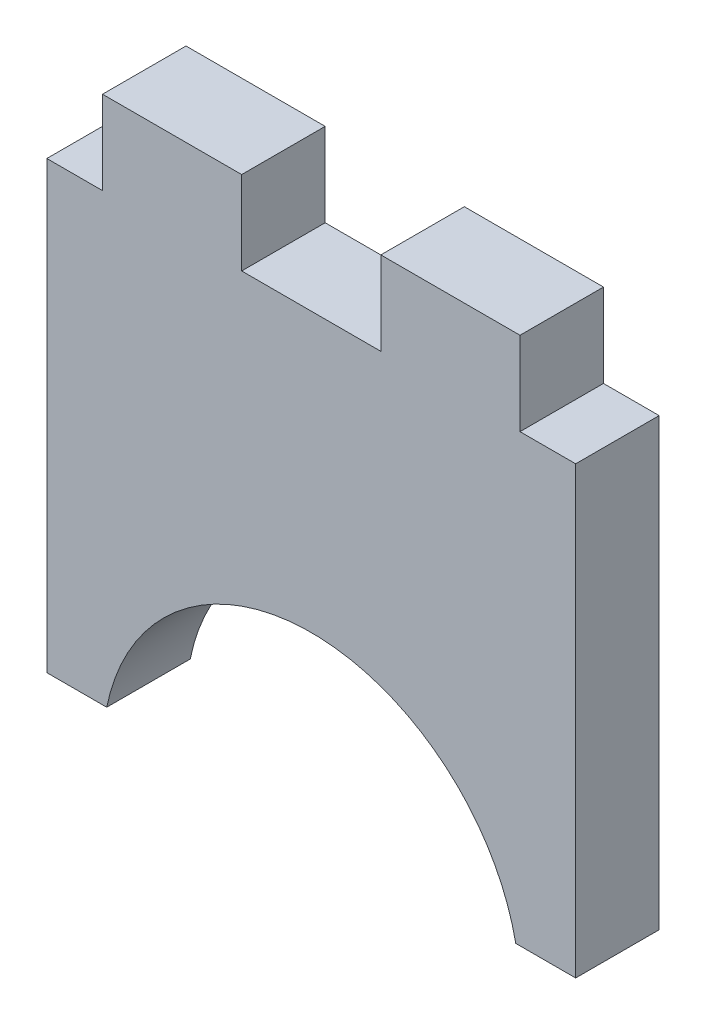
ISO-10303-21;
HEADER;
FILE_DESCRIPTION(('STEP AP214'),'2;1');
FILE_NAME('part.step','',(''),(''),'','','');
FILE_SCHEMA(('AUTOMOTIVE_DESIGN { 1 0 10303 214 1 1 1 1 }'));
ENDSEC;
DATA;
#1=APPLICATION_CONTEXT('core data for automotive mechanical design processes');
#2=APPLICATION_PROTOCOL_DEFINITION('international standard','automotive_design',2000,#1);
#3=PRODUCT_CONTEXT('',#1,'mechanical');
#4=PRODUCT('Part','Part','',(#3));
#5=PRODUCT_RELATED_PRODUCT_CATEGORY('part','',(#4));
#6=PRODUCT_DEFINITION_FORMATION('','',#4);
#7=PRODUCT_DEFINITION_CONTEXT('part definition',#1,'design');
#8=PRODUCT_DEFINITION('design','',#6,#7);
#9=PRODUCT_DEFINITION_SHAPE('','',#8);
#10=(LENGTH_UNIT() NAMED_UNIT(*) SI_UNIT(.MILLI.,.METRE.));
#11=(NAMED_UNIT(*) PLANE_ANGLE_UNIT() SI_UNIT($,.RADIAN.));
#12=(NAMED_UNIT(*) SI_UNIT($,.STERADIAN.) SOLID_ANGLE_UNIT());
#13=UNCERTAINTY_MEASURE_WITH_UNIT(LENGTH_MEASURE(1.E-05),#10,'distance_accuracy_value','');
#14=(GEOMETRIC_REPRESENTATION_CONTEXT(3) GLOBAL_UNCERTAINTY_ASSIGNED_CONTEXT((#13)) GLOBAL_UNIT_ASSIGNED_CONTEXT((#10,
#11,#12)) REPRESENTATION_CONTEXT('',''));
#15=CARTESIAN_POINT('',(0.,0.,0.));
#16=DIRECTION('',(0.,0.,1.));
#17=DIRECTION('',(1.,0.,0.));
#18=AXIS2_PLACEMENT_3D('',#15,#16,#17);
#19=CARTESIAN_POINT('',(-19.,0.,6.));
#20=DIRECTION('',(0.,0.,-1.));
#21=DIRECTION('',(-1.,0.,0.));
#22=AXIS2_PLACEMENT_3D('',#19,#20,#21);
#23=CYLINDRICAL_SURFACE('',#22,15.);
#24=CARTESIAN_POINT('',(-19.,0.,0.));
#25=DIRECTION('',(0.,0.,1.));
#26=DIRECTION('',(1.,0.,0.));
#27=AXIS2_PLACEMENT_3D('',#24,#25,#26);
#28=CIRCLE('',#27,15.);
#29=CARTESIAN_POINT('',(-4.30306154330094,3.,0.));
#30=VERTEX_POINT('',#29);
#31=CARTESIAN_POINT('',(-33.6969384566991,3.,0.));
#32=VERTEX_POINT('',#31);
#33=EDGE_CURVE('E164',#30,#32,#28,.T.);
#34=ORIENTED_EDGE('',*,*,#33,.F.);
#35=DIRECTION('',(0.,0.,-1.));
#36=VECTOR('',#35,1.);
#37=CARTESIAN_POINT('',(-4.30306154330094,3.,6.));
#38=LINE('',#37,#36);
#39=CARTESIAN_POINT('',(-4.30306154330094,3.,6.));
#40=VERTEX_POINT('',#39);
#41=EDGE_CURVE('E11',#40,#30,#38,.T.);
#42=ORIENTED_EDGE('',*,*,#41,.F.);
#43=CARTESIAN_POINT('',(-19.,0.,6.));
#44=DIRECTION('',(0.,0.,1.));
#45=DIRECTION('',(1.,0.,0.));
#46=AXIS2_PLACEMENT_3D('',#43,#44,#45);
#47=CIRCLE('',#46,15.);
#48=CARTESIAN_POINT('',(-33.6969384566991,3.,6.));
#49=VERTEX_POINT('',#48);
#50=EDGE_CURVE('E243',#40,#49,#47,.T.);
#51=ORIENTED_EDGE('',*,*,#50,.T.);
#52=DIRECTION('',(0.,0.,-1.));
#53=VECTOR('',#52,1.);
#54=CARTESIAN_POINT('',(-33.6969384566991,3.,6.));
#55=LINE('',#54,#53);
#56=EDGE_CURVE('E50',#49,#32,#55,.T.);
#57=ORIENTED_EDGE('',*,*,#56,.T.);
#58=EDGE_LOOP('',(#34,#42,#51,#57));
#59=FACE_BOUND('',#58,.T.);
#60=ADVANCED_FACE('F34',(#59),#23,.F.);
#61=CARTESIAN_POINT('',(0.,3.,6.));
#62=DIRECTION('',(0.,-1.,0.));
#63=DIRECTION('',(0.,0.,-1.));
#64=AXIS2_PLACEMENT_3D('',#61,#62,#63);
#65=PLANE('',#64);
#66=DIRECTION('',(-1.,0.,0.));
#67=VECTOR('',#66,1.);
#68=CARTESIAN_POINT('',(0.,3.,0.));
#69=LINE('',#68,#67);
#70=CARTESIAN_POINT('',(0.,3.,0.));
#71=VERTEX_POINT('',#70);
#72=EDGE_CURVE('E166',#71,#30,#69,.T.);
#73=ORIENTED_EDGE('',*,*,#72,.F.);
#74=DIRECTION('',(0.,0.,-1.));
#75=VECTOR('',#74,1.);
#76=CARTESIAN_POINT('',(0.,3.,6.));
#77=LINE('',#76,#75);
#78=CARTESIAN_POINT('',(0.,3.,6.));
#79=VERTEX_POINT('',#78);
#80=EDGE_CURVE('E42',#79,#71,#77,.T.);
#81=ORIENTED_EDGE('',*,*,#80,.F.);
#82=DIRECTION('',(-1.,0.,0.));
#83=VECTOR('',#82,1.);
#84=CARTESIAN_POINT('',(0.,3.,6.));
#85=LINE('',#84,#83);
#86=EDGE_CURVE('E161',#79,#40,#85,.T.);
#87=ORIENTED_EDGE('',*,*,#86,.T.);
#88=ORIENTED_EDGE('',*,*,#41,.T.);
#89=EDGE_LOOP('',(#73,#81,#87,#88));
#90=FACE_BOUND('',#89,.T.);
#91=ADVANCED_FACE('F228',(#90),#65,.T.);
#92=CARTESIAN_POINT('',(0.,0.,6.));
#93=DIRECTION('',(1.,0.,0.));
#94=DIRECTION('',(0.,0.,-1.));
#95=AXIS2_PLACEMENT_3D('',#92,#93,#94);
#96=PLANE('',#95);
#97=DIRECTION('',(0.,-1.,0.));
#98=VECTOR('',#97,1.);
#99=CARTESIAN_POINT('',(0.,0.,0.));
#100=LINE('',#99,#98);
#101=CARTESIAN_POINT('',(0.,35.,0.));
#102=VERTEX_POINT('',#101);
#103=EDGE_CURVE('E169',#102,#71,#100,.T.);
#104=ORIENTED_EDGE('',*,*,#103,.F.);
#105=DIRECTION('',(0.,0.,-1.));
#106=VECTOR('',#105,1.);
#107=CARTESIAN_POINT('',(0.,35.,6.));
#108=LINE('',#107,#106);
#109=CARTESIAN_POINT('',(0.,35.,6.));
#110=VERTEX_POINT('',#109);
#111=EDGE_CURVE('E217',#110,#102,#108,.T.);
#112=ORIENTED_EDGE('',*,*,#111,.F.);
#113=DIRECTION('',(0.,-1.,0.));
#114=VECTOR('',#113,1.);
#115=CARTESIAN_POINT('',(0.,0.,6.));
#116=LINE('',#115,#114);
#117=EDGE_CURVE('E224',#110,#79,#116,.T.);
#118=ORIENTED_EDGE('',*,*,#117,.T.);
#119=ORIENTED_EDGE('',*,*,#80,.T.);
#120=EDGE_LOOP('',(#104,#112,#118,#119));
#121=FACE_BOUND('',#120,.T.);
#122=ADVANCED_FACE('F222',(#121),#96,.T.);
#123=CARTESIAN_POINT('',(0.,35.,6.));
#124=DIRECTION('',(0.,1.,0.));
#125=DIRECTION('',(-1.,0.,0.));
#126=AXIS2_PLACEMENT_3D('',#123,#124,#125);
#127=PLANE('',#126);
#128=DIRECTION('',(1.,0.,0.));
#129=VECTOR('',#128,1.);
#130=CARTESIAN_POINT('',(0.,35.,0.));
#131=LINE('',#130,#129);
#132=CARTESIAN_POINT('',(-4.,35.,0.));
#133=VERTEX_POINT('',#132);
#134=EDGE_CURVE('E173',#133,#102,#131,.T.);
#135=ORIENTED_EDGE('',*,*,#134,.F.);
#136=DIRECTION('',(0.,0.,-1.));
#137=VECTOR('',#136,1.);
#138=CARTESIAN_POINT('',(-4.,35.,6.));
#139=LINE('',#138,#137);
#140=CARTESIAN_POINT('',(-4.,35.,6.));
#141=VERTEX_POINT('',#140);
#142=EDGE_CURVE('E215',#141,#133,#139,.T.);
#143=ORIENTED_EDGE('',*,*,#142,.F.);
#144=DIRECTION('',(1.,0.,0.));
#145=VECTOR('',#144,1.);
#146=CARTESIAN_POINT('',(0.,35.,6.));
#147=LINE('',#146,#145);
#148=EDGE_CURVE('E237',#141,#110,#147,.T.);
#149=ORIENTED_EDGE('',*,*,#148,.T.);
#150=ORIENTED_EDGE('',*,*,#111,.T.);
#151=EDGE_LOOP('',(#135,#143,#149,#150));
#152=FACE_BOUND('',#151,.T.);
#153=ADVANCED_FACE('F234',(#152),#127,.T.);
#154=CARTESIAN_POINT('',(-4.,0.,6.));
#155=DIRECTION('',(1.,0.,0.));
#156=DIRECTION('',(0.,0.,-1.));
#157=AXIS2_PLACEMENT_3D('',#154,#155,#156);
#158=PLANE('',#157);
#159=DIRECTION('',(0.,-1.,0.));
#160=VECTOR('',#159,1.);
#161=CARTESIAN_POINT('',(-4.,0.,0.));
#162=LINE('',#161,#160);
#163=CARTESIAN_POINT('',(-4.,41.,0.));
#164=VERTEX_POINT('',#163);
#165=EDGE_CURVE('E176',#164,#133,#162,.T.);
#166=ORIENTED_EDGE('',*,*,#165,.F.);
#167=DIRECTION('',(0.,0.,-1.));
#168=VECTOR('',#167,1.);
#169=CARTESIAN_POINT('',(-4.,41.,6.));
#170=LINE('',#169,#168);
#171=CARTESIAN_POINT('',(-4.,41.,6.));
#172=VERTEX_POINT('',#171);
#173=EDGE_CURVE('E213',#172,#164,#170,.T.);
#174=ORIENTED_EDGE('',*,*,#173,.F.);
#175=DIRECTION('',(0.,-1.,0.));
#176=VECTOR('',#175,1.);
#177=CARTESIAN_POINT('',(-4.,0.,6.));
#178=LINE('',#177,#176);
#179=EDGE_CURVE('E241',#172,#141,#178,.T.);
#180=ORIENTED_EDGE('',*,*,#179,.T.);
#181=ORIENTED_EDGE('',*,*,#142,.T.);
#182=EDGE_LOOP('',(#166,#174,#180,#181));
#183=FACE_BOUND('',#182,.T.);
#184=ADVANCED_FACE('F295',(#183),#158,.T.);
#185=CARTESIAN_POINT('',(0.,41.,6.));
#186=DIRECTION('',(0.,1.,0.));
#187=DIRECTION('',(-1.,0.,0.));
#188=AXIS2_PLACEMENT_3D('',#185,#186,#187);
#189=PLANE('',#188);
#190=DIRECTION('',(1.,0.,0.));
#191=VECTOR('',#190,1.);
#192=CARTESIAN_POINT('',(0.,41.,0.));
#193=LINE('',#192,#191);
#194=CARTESIAN_POINT('',(-14.,41.,0.));
#195=VERTEX_POINT('',#194);
#196=EDGE_CURVE('E179',#195,#164,#193,.T.);
#197=ORIENTED_EDGE('',*,*,#196,.F.);
#198=DIRECTION('',(0.,0.,-1.));
#199=VECTOR('',#198,1.);
#200=CARTESIAN_POINT('',(-14.,41.,6.));
#201=LINE('',#200,#199);
#202=CARTESIAN_POINT('',(-14.,41.,6.));
#203=VERTEX_POINT('',#202);
#204=EDGE_CURVE('E211',#203,#195,#201,.T.);
#205=ORIENTED_EDGE('',*,*,#204,.F.);
#206=DIRECTION('',(1.,0.,0.));
#207=VECTOR('',#206,1.);
#208=CARTESIAN_POINT('',(0.,41.,6.));
#209=LINE('',#208,#207);
#210=EDGE_CURVE('E247',#203,#172,#209,.T.);
#211=ORIENTED_EDGE('',*,*,#210,.T.);
#212=ORIENTED_EDGE('',*,*,#173,.T.);
#213=EDGE_LOOP('',(#197,#205,#211,#212));
#214=FACE_BOUND('',#213,.T.);
#215=ADVANCED_FACE('F302',(#214),#189,.T.);
#216=CARTESIAN_POINT('',(-14.,0.,6.));
#217=DIRECTION('',(-1.,0.,0.));
#218=DIRECTION('',(0.,0.,1.));
#219=AXIS2_PLACEMENT_3D('',#216,#217,#218);
#220=PLANE('',#219);
#221=DIRECTION('',(0.,1.,0.));
#222=VECTOR('',#221,1.);
#223=CARTESIAN_POINT('',(-14.,0.,0.));
#224=LINE('',#223,#222);
#225=CARTESIAN_POINT('',(-14.,35.,0.));
#226=VERTEX_POINT('',#225);
#227=EDGE_CURVE('E182',#226,#195,#224,.T.);
#228=ORIENTED_EDGE('',*,*,#227,.F.);
#229=DIRECTION('',(0.,0.,-1.));
#230=VECTOR('',#229,1.);
#231=CARTESIAN_POINT('',(-14.,35.,6.));
#232=LINE('',#231,#230);
#233=CARTESIAN_POINT('',(-14.,35.,6.));
#234=VERTEX_POINT('',#233);
#235=EDGE_CURVE('E209',#234,#226,#232,.T.);
#236=ORIENTED_EDGE('',*,*,#235,.F.);
#237=DIRECTION('',(0.,1.,0.));
#238=VECTOR('',#237,1.);
#239=CARTESIAN_POINT('',(-14.,0.,6.));
#240=LINE('',#239,#238);
#241=EDGE_CURVE('E250',#234,#203,#240,.T.);
#242=ORIENTED_EDGE('',*,*,#241,.T.);
#243=ORIENTED_EDGE('',*,*,#204,.T.);
#244=EDGE_LOOP('',(#228,#236,#242,#243));
#245=FACE_BOUND('',#244,.T.);
#246=ADVANCED_FACE('F310',(#245),#220,.T.);
#247=CARTESIAN_POINT('',(0.,35.,6.));
#248=DIRECTION('',(0.,1.,0.));
#249=DIRECTION('',(-1.,0.,0.));
#250=AXIS2_PLACEMENT_3D('',#247,#248,#249);
#251=PLANE('',#250);
#252=DIRECTION('',(1.,0.,0.));
#253=VECTOR('',#252,1.);
#254=CARTESIAN_POINT('',(0.,35.,0.));
#255=LINE('',#254,#253);
#256=CARTESIAN_POINT('',(-24.,35.,0.));
#257=VERTEX_POINT('',#256);
#258=EDGE_CURVE('E185',#257,#226,#255,.T.);
#259=ORIENTED_EDGE('',*,*,#258,.F.);
#260=DIRECTION('',(0.,0.,-1.));
#261=VECTOR('',#260,1.);
#262=CARTESIAN_POINT('',(-24.,35.,6.));
#263=LINE('',#262,#261);
#264=CARTESIAN_POINT('',(-24.,35.,6.));
#265=VERTEX_POINT('',#264);
#266=EDGE_CURVE('E207',#265,#257,#263,.T.);
#267=ORIENTED_EDGE('',*,*,#266,.F.);
#268=DIRECTION('',(1.,0.,0.));
#269=VECTOR('',#268,1.);
#270=CARTESIAN_POINT('',(0.,35.,6.));
#271=LINE('',#270,#269);
#272=EDGE_CURVE('E253',#265,#234,#271,.T.);
#273=ORIENTED_EDGE('',*,*,#272,.T.);
#274=ORIENTED_EDGE('',*,*,#235,.T.);
#275=EDGE_LOOP('',(#259,#267,#273,#274));
#276=FACE_BOUND('',#275,.T.);
#277=ADVANCED_FACE('F318',(#276),#251,.T.);
#278=CARTESIAN_POINT('',(-24.,0.,6.));
#279=DIRECTION('',(1.,0.,0.));
#280=DIRECTION('',(0.,0.,-1.));
#281=AXIS2_PLACEMENT_3D('',#278,#279,#280);
#282=PLANE('',#281);
#283=DIRECTION('',(0.,-1.,0.));
#284=VECTOR('',#283,1.);
#285=CARTESIAN_POINT('',(-24.,0.,0.));
#286=LINE('',#285,#284);
#287=CARTESIAN_POINT('',(-24.,41.,0.));
#288=VERTEX_POINT('',#287);
#289=EDGE_CURVE('E188',#288,#257,#286,.T.);
#290=ORIENTED_EDGE('',*,*,#289,.F.);
#291=DIRECTION('',(0.,0.,-1.));
#292=VECTOR('',#291,1.);
#293=CARTESIAN_POINT('',(-24.,41.,6.));
#294=LINE('',#293,#292);
#295=CARTESIAN_POINT('',(-24.,41.,6.));
#296=VERTEX_POINT('',#295);
#297=EDGE_CURVE('E205',#296,#288,#294,.T.);
#298=ORIENTED_EDGE('',*,*,#297,.F.);
#299=DIRECTION('',(0.,-1.,0.));
#300=VECTOR('',#299,1.);
#301=CARTESIAN_POINT('',(-24.,0.,6.));
#302=LINE('',#301,#300);
#303=EDGE_CURVE('E256',#296,#265,#302,.T.);
#304=ORIENTED_EDGE('',*,*,#303,.T.);
#305=ORIENTED_EDGE('',*,*,#266,.T.);
#306=EDGE_LOOP('',(#290,#298,#304,#305));
#307=FACE_BOUND('',#306,.T.);
#308=ADVANCED_FACE('F326',(#307),#282,.T.);
#309=CARTESIAN_POINT('',(0.,41.,6.));
#310=DIRECTION('',(0.,1.,0.));
#311=DIRECTION('',(0.,0.,1.));
#312=AXIS2_PLACEMENT_3D('',#309,#310,#311);
#313=PLANE('',#312);
#314=DIRECTION('',(1.,0.,0.));
#315=VECTOR('',#314,1.);
#316=CARTESIAN_POINT('',(0.,41.,0.));
#317=LINE('',#316,#315);
#318=CARTESIAN_POINT('',(-34.,41.,0.));
#319=VERTEX_POINT('',#318);
#320=EDGE_CURVE('E191',#319,#288,#317,.T.);
#321=ORIENTED_EDGE('',*,*,#320,.F.);
#322=DIRECTION('',(0.,0.,-1.));
#323=VECTOR('',#322,1.);
#324=CARTESIAN_POINT('',(-34.,41.,6.));
#325=LINE('',#324,#323);
#326=CARTESIAN_POINT('',(-34.,41.,6.));
#327=VERTEX_POINT('',#326);
#328=EDGE_CURVE('E203',#327,#319,#325,.T.);
#329=ORIENTED_EDGE('',*,*,#328,.F.);
#330=DIRECTION('',(1.,0.,0.));
#331=VECTOR('',#330,1.);
#332=CARTESIAN_POINT('',(0.,41.,6.));
#333=LINE('',#332,#331);
#334=EDGE_CURVE('E259',#327,#296,#333,.T.);
#335=ORIENTED_EDGE('',*,*,#334,.T.);
#336=ORIENTED_EDGE('',*,*,#297,.T.);
#337=EDGE_LOOP('',(#321,#329,#335,#336));
#338=FACE_BOUND('',#337,.T.);
#339=ADVANCED_FACE('F334',(#338),#313,.T.);
#340=CARTESIAN_POINT('',(-34.,0.,6.));
#341=DIRECTION('',(-1.,0.,0.));
#342=DIRECTION('',(0.,0.,1.));
#343=AXIS2_PLACEMENT_3D('',#340,#341,#342);
#344=PLANE('',#343);
#345=DIRECTION('',(0.,1.,0.));
#346=VECTOR('',#345,1.);
#347=CARTESIAN_POINT('',(-34.,0.,0.));
#348=LINE('',#347,#346);
#349=CARTESIAN_POINT('',(-34.,35.,0.));
#350=VERTEX_POINT('',#349);
#351=EDGE_CURVE('E194',#350,#319,#348,.T.);
#352=ORIENTED_EDGE('',*,*,#351,.F.);
#353=DIRECTION('',(0.,0.,-1.));
#354=VECTOR('',#353,1.);
#355=CARTESIAN_POINT('',(-34.,35.,6.));
#356=LINE('',#355,#354);
#357=CARTESIAN_POINT('',(-34.,35.,6.));
#358=VERTEX_POINT('',#357);
#359=EDGE_CURVE('E145',#358,#350,#356,.T.);
#360=ORIENTED_EDGE('',*,*,#359,.F.);
#361=DIRECTION('',(0.,1.,0.));
#362=VECTOR('',#361,1.);
#363=CARTESIAN_POINT('',(-34.,0.,6.));
#364=LINE('',#363,#362);
#365=EDGE_CURVE('E155',#358,#327,#364,.T.);
#366=ORIENTED_EDGE('',*,*,#365,.T.);
#367=ORIENTED_EDGE('',*,*,#328,.T.);
#368=EDGE_LOOP('',(#352,#360,#366,#367));
#369=FACE_BOUND('',#368,.T.);
#370=ADVANCED_FACE('F263',(#369),#344,.T.);
#371=CARTESIAN_POINT('',(0.,35.,6.));
#372=DIRECTION('',(0.,1.,0.));
#373=DIRECTION('',(0.,0.,1.));
#374=AXIS2_PLACEMENT_3D('',#371,#372,#373);
#375=PLANE('',#374);
#376=DIRECTION('',(1.,0.,0.));
#377=VECTOR('',#376,1.);
#378=CARTESIAN_POINT('',(0.,35.,0.));
#379=LINE('',#378,#377);
#380=CARTESIAN_POINT('',(-38.,35.,0.));
#381=VERTEX_POINT('',#380);
#382=EDGE_CURVE('E141',#381,#350,#379,.T.);
#383=ORIENTED_EDGE('',*,*,#382,.F.);
#384=DIRECTION('',(0.,0.,-1.));
#385=VECTOR('',#384,1.);
#386=CARTESIAN_POINT('',(-38.,35.,6.));
#387=LINE('',#386,#385);
#388=CARTESIAN_POINT('',(-38.,35.,6.));
#389=VERTEX_POINT('',#388);
#390=EDGE_CURVE('E136',#389,#381,#387,.T.);
#391=ORIENTED_EDGE('',*,*,#390,.F.);
#392=DIRECTION('',(1.,0.,0.));
#393=VECTOR('',#392,1.);
#394=CARTESIAN_POINT('',(0.,35.,6.));
#395=LINE('',#394,#393);
#396=EDGE_CURVE('E139',#389,#358,#395,.T.);
#397=ORIENTED_EDGE('',*,*,#396,.T.);
#398=ORIENTED_EDGE('',*,*,#359,.T.);
#399=EDGE_LOOP('',(#383,#391,#397,#398));
#400=FACE_BOUND('',#399,.T.);
#401=ADVANCED_FACE('F138',(#400),#375,.T.);
#402=CARTESIAN_POINT('',(-38.,0.,6.));
#403=DIRECTION('',(-1.,0.,0.));
#404=DIRECTION('',(0.,0.,1.));
#405=AXIS2_PLACEMENT_3D('',#402,#403,#404);
#406=PLANE('',#405);
#407=DIRECTION('',(0.,1.,0.));
#408=VECTOR('',#407,1.);
#409=CARTESIAN_POINT('',(-38.,0.,0.));
#410=LINE('',#409,#408);
#411=CARTESIAN_POINT('',(-38.,3.,0.));
#412=VERTEX_POINT('',#411);
#413=EDGE_CURVE('E198',#412,#381,#410,.T.);
#414=ORIENTED_EDGE('',*,*,#413,.F.);
#415=DIRECTION('',(0.,0.,-1.));
#416=VECTOR('',#415,1.);
#417=CARTESIAN_POINT('',(-38.,3.,6.));
#418=LINE('',#417,#416);
#419=CARTESIAN_POINT('',(-38.,3.,6.));
#420=VERTEX_POINT('',#419);
#421=EDGE_CURVE('E93',#420,#412,#418,.T.);
#422=ORIENTED_EDGE('',*,*,#421,.F.);
#423=DIRECTION('',(0.,1.,0.));
#424=VECTOR('',#423,1.);
#425=CARTESIAN_POINT('',(-38.,0.,6.));
#426=LINE('',#425,#424);
#427=EDGE_CURVE('E152',#420,#389,#426,.T.);
#428=ORIENTED_EDGE('',*,*,#427,.T.);
#429=ORIENTED_EDGE('',*,*,#390,.T.);
#430=EDGE_LOOP('',(#414,#422,#428,#429));
#431=FACE_BOUND('',#430,.T.);
#432=ADVANCED_FACE('F157',(#431),#406,.T.);
#433=EDGE_CURVE('E170',#32,#412,#69,.T.);
#434=ORIENTED_EDGE('',*,*,#433,.F.);
#435=ORIENTED_EDGE('',*,*,#56,.F.);
#436=EDGE_CURVE('E158',#49,#420,#85,.T.);
#437=ORIENTED_EDGE('',*,*,#436,.T.);
#438=ORIENTED_EDGE('',*,*,#421,.T.);
#439=EDGE_LOOP('',(#434,#435,#437,#438));
#440=FACE_BOUND('',#439,.T.);
#441=ADVANCED_FACE('F266',(#440),#65,.T.);
#442=CARTESIAN_POINT('',(0.,0.,6.));
#443=DIRECTION('',(0.,0.,1.));
#444=DIRECTION('',(1.,0.,0.));
#445=AXIS2_PLACEMENT_3D('',#442,#443,#444);
#446=PLANE('',#445);
#447=ORIENTED_EDGE('',*,*,#50,.F.);
#448=ORIENTED_EDGE('',*,*,#86,.F.);
#449=ORIENTED_EDGE('',*,*,#117,.F.);
#450=ORIENTED_EDGE('',*,*,#148,.F.);
#451=ORIENTED_EDGE('',*,*,#179,.F.);
#452=ORIENTED_EDGE('',*,*,#210,.F.);
#453=ORIENTED_EDGE('',*,*,#241,.F.);
#454=ORIENTED_EDGE('',*,*,#272,.F.);
#455=ORIENTED_EDGE('',*,*,#303,.F.);
#456=ORIENTED_EDGE('',*,*,#334,.F.);
#457=ORIENTED_EDGE('',*,*,#365,.F.);
#458=ORIENTED_EDGE('',*,*,#396,.F.);
#459=ORIENTED_EDGE('',*,*,#427,.F.);
#460=ORIENTED_EDGE('',*,*,#436,.F.);
#461=EDGE_LOOP('',(#447,#448,#449,#450,#451,#452,#453,#454,#455,#456,#457,#458,#459,#460));
#462=FACE_BOUND('',#461,.T.);
#463=ADVANCED_FACE('F150',(#462),#446,.T.);
#464=CARTESIAN_POINT('',(0.,0.,0.));
#465=DIRECTION('',(0.,0.,1.));
#466=DIRECTION('',(1.,0.,0.));
#467=AXIS2_PLACEMENT_3D('',#464,#465,#466);
#468=PLANE('',#467);
#469=ORIENTED_EDGE('',*,*,#33,.T.);
#470=ORIENTED_EDGE('',*,*,#433,.T.);
#471=ORIENTED_EDGE('',*,*,#413,.T.);
#472=ORIENTED_EDGE('',*,*,#382,.T.);
#473=ORIENTED_EDGE('',*,*,#351,.T.);
#474=ORIENTED_EDGE('',*,*,#320,.T.);
#475=ORIENTED_EDGE('',*,*,#289,.T.);
#476=ORIENTED_EDGE('',*,*,#258,.T.);
#477=ORIENTED_EDGE('',*,*,#227,.T.);
#478=ORIENTED_EDGE('',*,*,#196,.T.);
#479=ORIENTED_EDGE('',*,*,#165,.T.);
#480=ORIENTED_EDGE('',*,*,#134,.T.);
#481=ORIENTED_EDGE('',*,*,#103,.T.);
#482=ORIENTED_EDGE('',*,*,#72,.T.);
#483=EDGE_LOOP('',(#469,#470,#471,#472,#473,#474,#475,#476,#477,#478,#479,#480,#481,#482));
#484=FACE_BOUND('',#483,.T.);
#485=ADVANCED_FACE('F230',(#484),#468,.F.);
#486=CLOSED_SHELL('',(#60,#91,#122,#153,#184,#215,#246,#277,#308,#339,#370,#401,#432,#441,#463,#485));
#487=MANIFOLD_SOLID_BREP('B2',#486);
#488=ADVANCED_BREP_SHAPE_REPRESENTATION('',(#18,#487),#14);
#489=SHAPE_DEFINITION_REPRESENTATION(#9,#488);
ENDSEC;
END-ISO-10303-21;
